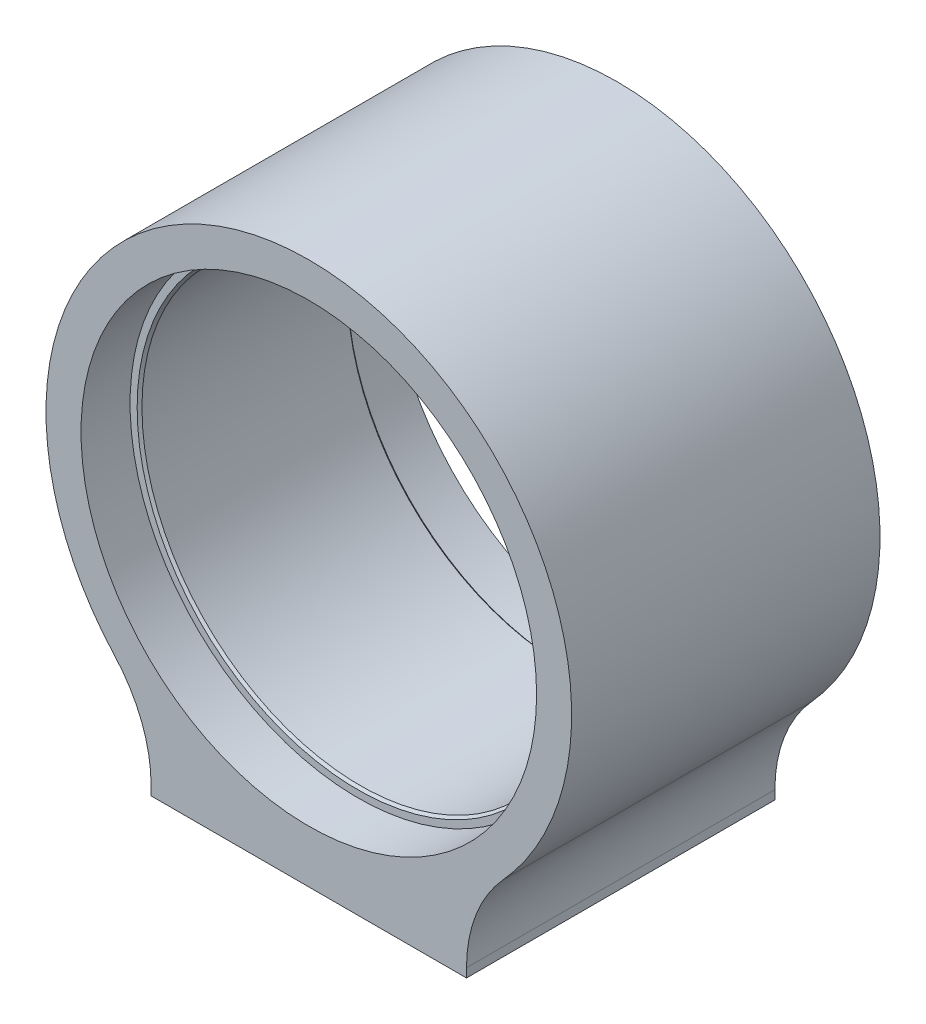
ISO-10303-21;
HEADER;
FILE_DESCRIPTION(('STEP AP214'),'2;1');
FILE_NAME('part.step','',(''),(''),'','','');
FILE_SCHEMA(('AUTOMOTIVE_DESIGN { 1 0 10303 214 1 1 1 1 }'));
ENDSEC;
DATA;
#1=APPLICATION_CONTEXT('core data for automotive mechanical design processes');
#2=APPLICATION_PROTOCOL_DEFINITION('international standard','automotive_design',2000,#1);
#3=PRODUCT_CONTEXT('',#1,'mechanical');
#4=PRODUCT('Part','Part','',(#3));
#5=PRODUCT_RELATED_PRODUCT_CATEGORY('part','',(#4));
#6=PRODUCT_DEFINITION_FORMATION('','',#4);
#7=PRODUCT_DEFINITION_CONTEXT('part definition',#1,'design');
#8=PRODUCT_DEFINITION('design','',#6,#7);
#9=PRODUCT_DEFINITION_SHAPE('','',#8);
#10=(LENGTH_UNIT() NAMED_UNIT(*) SI_UNIT(.MILLI.,.METRE.));
#11=(NAMED_UNIT(*) PLANE_ANGLE_UNIT() SI_UNIT($,.RADIAN.));
#12=(NAMED_UNIT(*) SI_UNIT($,.STERADIAN.) SOLID_ANGLE_UNIT());
#13=UNCERTAINTY_MEASURE_WITH_UNIT(LENGTH_MEASURE(1.E-05),#10,'distance_accuracy_value','');
#14=(GEOMETRIC_REPRESENTATION_CONTEXT(3) GLOBAL_UNCERTAINTY_ASSIGNED_CONTEXT((#13)) GLOBAL_UNIT_ASSIGNED_CONTEXT((#10,
#11,#12)) REPRESENTATION_CONTEXT('',''));
#15=CARTESIAN_POINT('',(0.,0.,0.));
#16=DIRECTION('',(0.,0.,1.));
#17=DIRECTION('',(1.,0.,0.));
#18=AXIS2_PLACEMENT_3D('',#15,#16,#17);
#19=CARTESIAN_POINT('',(0.,0.,-15.));
#20=DIRECTION('',(0.,0.,1.));
#21=DIRECTION('',(1.,0.,0.));
#22=AXIS2_PLACEMENT_3D('',#19,#20,#21);
#23=CYLINDRICAL_SURFACE('',#22,37.5);
#24=CARTESIAN_POINT('',(0.,0.,22.));
#25=DIRECTION('',(0.,0.,1.));
#26=DIRECTION('',(1.,0.,0.));
#27=AXIS2_PLACEMENT_3D('',#24,#25,#26);
#28=CIRCLE('',#27,37.5);
#29=CARTESIAN_POINT('',(27.7173913043478,-25.2585870404831,22.));
#30=VERTEX_POINT('',#29);
#31=CARTESIAN_POINT('',(-27.7173913043478,-25.2585870404831,22.));
#32=VERTEX_POINT('',#31);
#33=EDGE_CURVE('E182',#30,#32,#28,.T.);
#34=ORIENTED_EDGE('',*,*,#33,.F.);
#35=DIRECTION('',(0.,0.,1.));
#36=VECTOR('',#35,1.);
#37=CARTESIAN_POINT('',(27.7173913043478,-25.2585870404831,-15.));
#38=LINE('',#37,#36);
#39=CARTESIAN_POINT('',(27.7173913043478,-25.2585870404831,-22.));
#40=VERTEX_POINT('',#39);
#41=EDGE_CURVE('E234',#30,#40,#38,.F.);
#42=ORIENTED_EDGE('',*,*,#41,.T.);
#43=CARTESIAN_POINT('',(0.,0.,-22.));
#44=DIRECTION('',(0.,0.,-1.));
#45=DIRECTION('',(-1.,0.,0.));
#46=AXIS2_PLACEMENT_3D('',#43,#44,#45);
#47=CIRCLE('',#46,37.5);
#48=CARTESIAN_POINT('',(-27.7173913043478,-25.2585870404831,-22.));
#49=VERTEX_POINT('',#48);
#50=EDGE_CURVE('E206',#49,#40,#47,.T.);
#51=ORIENTED_EDGE('',*,*,#50,.F.);
#52=DIRECTION('',(0.,0.,1.));
#53=VECTOR('',#52,1.);
#54=CARTESIAN_POINT('',(-27.7173913043478,-25.2585870404832,-15.));
#55=LINE('',#54,#53);
#56=EDGE_CURVE('E232',#49,#32,#55,.T.);
#57=ORIENTED_EDGE('',*,*,#56,.T.);
#58=EDGE_LOOP('',(#34,#42,#51,#57));
#59=FACE_BOUND('',#58,.T.);
#60=ADVANCED_FACE('F34',(#59),#23,.T.);
#61=CARTESIAN_POINT('',(0.,0.,-15.));
#62=DIRECTION('',(0.,0.,1.));
#63=DIRECTION('',(1.,0.,0.));
#64=AXIS2_PLACEMENT_3D('',#61,#62,#63);
#65=PLANE('',#64);
#66=CARTESIAN_POINT('',(0.,0.,-15.));
#67=DIRECTION('',(0.,0.,-1.));
#68=DIRECTION('',(-1.,0.,0.));
#69=AXIS2_PLACEMENT_3D('',#66,#67,#68);
#70=CIRCLE('',#69,31.4930364542791);
#71=CARTESIAN_POINT('',(-31.4930364542791,0.,-15.));
#72=VERTEX_POINT('',#71);
#73=EDGE_CURVE('E149',#72,#72,#70,.T.);
#74=ORIENTED_EDGE('',*,*,#73,.F.);
#75=EDGE_LOOP('',(#74));
#76=FACE_BOUND('',#75,.T.);
#77=CARTESIAN_POINT('',(0.,0.,-15.));
#78=DIRECTION('',(0.,0.,-1.));
#79=DIRECTION('',(-1.,0.,0.));
#80=AXIS2_PLACEMENT_3D('',#77,#78,#79);
#81=CIRCLE('',#80,32.5);
#82=CARTESIAN_POINT('',(-32.5,0.,-15.));
#83=VERTEX_POINT('',#82);
#84=EDGE_CURVE('E202',#83,#83,#81,.T.);
#85=ORIENTED_EDGE('',*,*,#84,.T.);
#86=EDGE_LOOP('',(#85));
#87=FACE_BOUND('',#86,.T.);
#88=ADVANCED_FACE('F278',(#76,#87),#65,.F.);
#89=CARTESIAN_POINT('',(0.,0.,-15.));
#90=DIRECTION('',(0.,0.,1.));
#91=DIRECTION('',(1.,0.,0.));
#92=AXIS2_PLACEMENT_3D('',#89,#90,#91);
#93=CYLINDRICAL_SURFACE('',#92,31.15);
#94=CARTESIAN_POINT('',(0.,0.,-14.6569635457209));
#95=DIRECTION('',(0.,0.,-1.));
#96=DIRECTION('',(-1.,0.,0.));
#97=AXIS2_PLACEMENT_3D('',#94,#95,#96);
#98=CIRCLE('',#97,31.15);
#99=CARTESIAN_POINT('',(-31.15,0.,-14.6569635457209));
#100=VERTEX_POINT('',#99);
#101=EDGE_CURVE('E38',#100,#100,#98,.T.);
#102=ORIENTED_EDGE('',*,*,#101,.T.);
#103=EDGE_LOOP('',(#102));
#104=FACE_BOUND('',#103,.T.);
#105=CARTESIAN_POINT('',(0.,0.,14.6569635457209));
#106=DIRECTION('',(0.,0.,1.));
#107=DIRECTION('',(1.,0.,0.));
#108=AXIS2_PLACEMENT_3D('',#105,#106,#107);
#109=CIRCLE('',#108,31.15);
#110=CARTESIAN_POINT('',(31.15,0.,14.6569635457209));
#111=VERTEX_POINT('',#110);
#112=EDGE_CURVE('E155',#111,#111,#109,.T.);
#113=ORIENTED_EDGE('',*,*,#112,.T.);
#114=EDGE_LOOP('',(#113));
#115=FACE_BOUND('',#114,.T.);
#116=ADVANCED_FACE('F283',(#104,#115),#93,.F.);
#117=CARTESIAN_POINT('',(0.,0.,15.));
#118=DIRECTION('',(0.,0.,1.));
#119=DIRECTION('',(1.,0.,0.));
#120=AXIS2_PLACEMENT_3D('',#117,#118,#119);
#121=PLANE('',#120);
#122=CARTESIAN_POINT('',(0.,0.,15.));
#123=DIRECTION('',(0.,0.,-1.));
#124=DIRECTION('',(-1.,0.,0.));
#125=AXIS2_PLACEMENT_3D('',#122,#123,#124);
#126=CIRCLE('',#125,31.4930364542791);
#127=CARTESIAN_POINT('',(-31.4930364542791,0.,15.));
#128=VERTEX_POINT('',#127);
#129=EDGE_CURVE('E152',#128,#128,#126,.T.);
#130=ORIENTED_EDGE('',*,*,#129,.T.);
#131=EDGE_LOOP('',(#130));
#132=FACE_BOUND('',#131,.T.);
#133=CARTESIAN_POINT('',(0.,0.,15.));
#134=DIRECTION('',(0.,0.,1.));
#135=DIRECTION('',(1.,0.,0.));
#136=AXIS2_PLACEMENT_3D('',#133,#134,#135);
#137=CIRCLE('',#136,32.5);
#138=CARTESIAN_POINT('',(32.5,0.,15.));
#139=VERTEX_POINT('',#138);
#140=EDGE_CURVE('E229',#139,#139,#137,.F.);
#141=ORIENTED_EDGE('',*,*,#140,.F.);
#142=EDGE_LOOP('',(#141));
#143=FACE_BOUND('',#142,.T.);
#144=ADVANCED_FACE('F288',(#132,#143),#121,.T.);
#145=CARTESIAN_POINT('',(0.,0.,-22.));
#146=DIRECTION('',(0.,0.,1.));
#147=DIRECTION('',(1.,0.,0.));
#148=AXIS2_PLACEMENT_3D('',#145,#146,#147);
#149=CYLINDRICAL_SURFACE('',#148,32.5);
#150=CARTESIAN_POINT('',(0.,0.,-22.));
#151=DIRECTION('',(0.,0.,-1.));
#152=DIRECTION('',(-1.,0.,0.));
#153=AXIS2_PLACEMENT_3D('',#150,#151,#152);
#154=CIRCLE('',#153,32.5);
#155=CARTESIAN_POINT('',(-32.5,0.,-22.));
#156=VERTEX_POINT('',#155);
#157=EDGE_CURVE('E203',#156,#156,#154,.T.);
#158=ORIENTED_EDGE('',*,*,#157,.T.);
#159=EDGE_LOOP('',(#158));
#160=FACE_BOUND('',#159,.T.);
#161=ORIENTED_EDGE('',*,*,#84,.F.);
#162=EDGE_LOOP('',(#161));
#163=FACE_BOUND('',#162,.T.);
#164=ADVANCED_FACE('F293',(#160,#163),#149,.F.);
#165=CARTESIAN_POINT('',(0.,0.,-22.));
#166=DIRECTION('',(0.,0.,-1.));
#167=DIRECTION('',(-1.,0.,0.));
#168=AXIS2_PLACEMENT_3D('',#165,#166,#167);
#169=PLANE('',#168);
#170=ORIENTED_EDGE('',*,*,#157,.F.);
#171=EDGE_LOOP('',(#170));
#172=FACE_BOUND('',#171,.T.);
#173=DIRECTION('',(0.,-1.,0.));
#174=VECTOR('',#173,1.);
#175=CARTESIAN_POINT('',(-22.5,-40.,-22.));
#176=LINE('',#175,#174);
#177=CARTESIAN_POINT('',(-22.5,-38.7298334620742,-22.));
#178=VERTEX_POINT('',#177);
#179=CARTESIAN_POINT('',(-22.5,-40.,-22.));
#180=VERTEX_POINT('',#179);
#181=EDGE_CURVE('E158',#178,#180,#176,.T.);
#182=ORIENTED_EDGE('',*,*,#181,.F.);
#183=CARTESIAN_POINT('',(-42.5,-38.7298334620742,-22.));
#184=DIRECTION('',(0.,0.,-1.));
#185=DIRECTION('',(-1.,0.,0.));
#186=AXIS2_PLACEMENT_3D('',#183,#184,#185);
#187=CIRCLE('',#186,20.);
#188=EDGE_CURVE('E44',#178,#49,#187,.F.);
#189=ORIENTED_EDGE('',*,*,#188,.T.);
#190=ORIENTED_EDGE('',*,*,#50,.T.);
#191=CARTESIAN_POINT('',(42.5,-38.7298334620742,-22.));
#192=DIRECTION('',(0.,0.,-1.));
#193=DIRECTION('',(-1.,0.,0.));
#194=AXIS2_PLACEMENT_3D('',#191,#192,#193);
#195=CIRCLE('',#194,20.);
#196=CARTESIAN_POINT('',(22.5,-38.7298334620742,-22.));
#197=VERTEX_POINT('',#196);
#198=EDGE_CURVE('E241',#40,#197,#195,.F.);
#199=ORIENTED_EDGE('',*,*,#198,.T.);
#200=DIRECTION('',(0.,1.,0.));
#201=VECTOR('',#200,1.);
#202=CARTESIAN_POINT('',(22.5,-30.,-22.));
#203=LINE('',#202,#201);
#204=CARTESIAN_POINT('',(22.5,-40.,-22.));
#205=VERTEX_POINT('',#204);
#206=EDGE_CURVE('E159',#205,#197,#203,.T.);
#207=ORIENTED_EDGE('',*,*,#206,.F.);
#208=DIRECTION('',(1.,0.,0.));
#209=VECTOR('',#208,1.);
#210=CARTESIAN_POINT('',(22.5,-40.,-22.));
#211=LINE('',#210,#209);
#212=EDGE_CURVE('E163',#180,#205,#211,.T.);
#213=ORIENTED_EDGE('',*,*,#212,.F.);
#214=EDGE_LOOP('',(#182,#189,#190,#199,#207,#213));
#215=FACE_BOUND('',#214,.T.);
#216=ADVANCED_FACE('F248',(#172,#215),#169,.T.);
#217=CARTESIAN_POINT('',(0.,0.,22.));
#218=DIRECTION('',(0.,0.,-1.));
#219=DIRECTION('',(-1.,0.,0.));
#220=AXIS2_PLACEMENT_3D('',#217,#218,#219);
#221=CYLINDRICAL_SURFACE('',#220,32.5);
#222=CARTESIAN_POINT('',(0.,0.,22.));
#223=DIRECTION('',(0.,0.,1.));
#224=DIRECTION('',(1.,0.,0.));
#225=AXIS2_PLACEMENT_3D('',#222,#223,#224);
#226=CIRCLE('',#225,32.5);
#227=CARTESIAN_POINT('',(32.5,0.,22.));
#228=VERTEX_POINT('',#227);
#229=EDGE_CURVE('E169',#228,#228,#226,.T.);
#230=ORIENTED_EDGE('',*,*,#229,.T.);
#231=EDGE_LOOP('',(#230));
#232=FACE_BOUND('',#231,.T.);
#233=ORIENTED_EDGE('',*,*,#140,.T.);
#234=EDGE_LOOP('',(#233));
#235=FACE_BOUND('',#234,.T.);
#236=ADVANCED_FACE('F319',(#232,#235),#221,.F.);
#237=CARTESIAN_POINT('',(0.,0.,22.));
#238=DIRECTION('',(0.,0.,1.));
#239=DIRECTION('',(1.,0.,0.));
#240=AXIS2_PLACEMENT_3D('',#237,#238,#239);
#241=PLANE('',#240);
#242=ORIENTED_EDGE('',*,*,#229,.F.);
#243=EDGE_LOOP('',(#242));
#244=FACE_BOUND('',#243,.T.);
#245=DIRECTION('',(0.,1.,0.));
#246=VECTOR('',#245,1.);
#247=CARTESIAN_POINT('',(22.5,-30.,22.));
#248=LINE('',#247,#246);
#249=CARTESIAN_POINT('',(22.5,-40.,22.));
#250=VERTEX_POINT('',#249);
#251=CARTESIAN_POINT('',(22.5,-38.7298334620742,22.));
#252=VERTEX_POINT('',#251);
#253=EDGE_CURVE('E170',#250,#252,#248,.T.);
#254=ORIENTED_EDGE('',*,*,#253,.T.);
#255=CARTESIAN_POINT('',(42.5,-38.7298334620742,22.));
#256=DIRECTION('',(0.,0.,1.));
#257=DIRECTION('',(1.,0.,0.));
#258=AXIS2_PLACEMENT_3D('',#255,#256,#257);
#259=CIRCLE('',#258,20.);
#260=EDGE_CURVE('E243',#252,#30,#259,.F.);
#261=ORIENTED_EDGE('',*,*,#260,.T.);
#262=ORIENTED_EDGE('',*,*,#33,.T.);
#263=CARTESIAN_POINT('',(-42.5,-38.7298334620742,22.));
#264=DIRECTION('',(0.,0.,1.));
#265=DIRECTION('',(1.,0.,0.));
#266=AXIS2_PLACEMENT_3D('',#263,#264,#265);
#267=CIRCLE('',#266,20.);
#268=CARTESIAN_POINT('',(-22.5,-38.7298334620742,22.));
#269=VERTEX_POINT('',#268);
#270=EDGE_CURVE('E11',#32,#269,#267,.F.);
#271=ORIENTED_EDGE('',*,*,#270,.T.);
#272=DIRECTION('',(0.,-1.,0.));
#273=VECTOR('',#272,1.);
#274=CARTESIAN_POINT('',(-22.5,-40.,22.));
#275=LINE('',#274,#273);
#276=CARTESIAN_POINT('',(-22.5,-40.,22.));
#277=VERTEX_POINT('',#276);
#278=EDGE_CURVE('E167',#269,#277,#275,.T.);
#279=ORIENTED_EDGE('',*,*,#278,.T.);
#280=DIRECTION('',(1.,0.,0.));
#281=VECTOR('',#280,1.);
#282=CARTESIAN_POINT('',(22.5,-40.,22.));
#283=LINE('',#282,#281);
#284=EDGE_CURVE('E173',#277,#250,#283,.T.);
#285=ORIENTED_EDGE('',*,*,#284,.T.);
#286=EDGE_LOOP('',(#254,#261,#262,#271,#279,#285));
#287=FACE_BOUND('',#286,.T.);
#288=ADVANCED_FACE('F257',(#244,#287),#241,.T.);
#289=CARTESIAN_POINT('',(22.5,-30.,68.0977222864644));
#290=DIRECTION('',(-1.,0.,0.));
#291=DIRECTION('',(0.,-1.,0.));
#292=AXIS2_PLACEMENT_3D('',#289,#290,#291);
#293=PLANE('',#292);
#294=ORIENTED_EDGE('',*,*,#206,.T.);
#295=DIRECTION('',(0.,0.,1.));
#296=VECTOR('',#295,1.);
#297=CARTESIAN_POINT('',(22.5,-38.7298334620742,68.0977222864644));
#298=LINE('',#297,#296);
#299=EDGE_CURVE('E237',#197,#252,#298,.T.);
#300=ORIENTED_EDGE('',*,*,#299,.T.);
#301=ORIENTED_EDGE('',*,*,#253,.F.);
#302=DIRECTION('',(0.,0.,-1.));
#303=VECTOR('',#302,1.);
#304=CARTESIAN_POINT('',(22.5,-40.,68.0977222864644));
#305=LINE('',#304,#303);
#306=EDGE_CURVE('E162',#250,#205,#305,.T.);
#307=ORIENTED_EDGE('',*,*,#306,.T.);
#308=EDGE_LOOP('',(#294,#300,#301,#307));
#309=FACE_BOUND('',#308,.T.);
#310=ADVANCED_FACE('F264',(#309),#293,.F.);
#311=CARTESIAN_POINT('',(-22.5,-40.,68.0977222864644));
#312=DIRECTION('',(1.,0.,0.));
#313=DIRECTION('',(0.,0.,-1.));
#314=AXIS2_PLACEMENT_3D('',#311,#312,#313);
#315=PLANE('',#314);
#316=ORIENTED_EDGE('',*,*,#278,.F.);
#317=DIRECTION('',(0.,0.,1.));
#318=VECTOR('',#317,1.);
#319=CARTESIAN_POINT('',(-22.5,-38.7298334620742,68.0977222864644));
#320=LINE('',#319,#318);
#321=EDGE_CURVE('E239',#269,#178,#320,.F.);
#322=ORIENTED_EDGE('',*,*,#321,.T.);
#323=ORIENTED_EDGE('',*,*,#181,.T.);
#324=DIRECTION('',(0.,0.,-1.));
#325=VECTOR('',#324,1.);
#326=CARTESIAN_POINT('',(-22.5,-40.,68.0977222864644));
#327=LINE('',#326,#325);
#328=EDGE_CURVE('E176',#277,#180,#327,.T.);
#329=ORIENTED_EDGE('',*,*,#328,.F.);
#330=EDGE_LOOP('',(#316,#322,#323,#329));
#331=FACE_BOUND('',#330,.T.);
#332=ADVANCED_FACE('F254',(#331),#315,.F.);
#333=CARTESIAN_POINT('',(22.5,-40.,68.0977222864644));
#334=DIRECTION('',(0.,1.,0.));
#335=DIRECTION('',(0.,0.,1.));
#336=AXIS2_PLACEMENT_3D('',#333,#334,#335);
#337=PLANE('',#336);
#338=CARTESIAN_POINT('',(17.5,-40.,17.5));
#339=DIRECTION('',(0.,-1.,0.));
#340=DIRECTION('',(0.,0.,-1.));
#341=AXIS2_PLACEMENT_3D('',#338,#339,#340);
#342=CIRCLE('',#341,1.25);
#343=CARTESIAN_POINT('',(17.5,-40.,16.25));
#344=VERTEX_POINT('',#343);
#345=EDGE_CURVE('E127',#344,#344,#342,.T.);
#346=ORIENTED_EDGE('',*,*,#345,.F.);
#347=EDGE_LOOP('',(#346));
#348=FACE_BOUND('',#347,.T.);
#349=CARTESIAN_POINT('',(17.5,-40.,-17.5));
#350=DIRECTION('',(0.,-1.,0.));
#351=DIRECTION('',(0.,0.,-1.));
#352=AXIS2_PLACEMENT_3D('',#349,#350,#351);
#353=CIRCLE('',#352,1.25);
#354=CARTESIAN_POINT('',(17.5,-40.,-18.75));
#355=VERTEX_POINT('',#354);
#356=EDGE_CURVE('E126',#355,#355,#353,.T.);
#357=ORIENTED_EDGE('',*,*,#356,.F.);
#358=EDGE_LOOP('',(#357));
#359=FACE_BOUND('',#358,.T.);
#360=CARTESIAN_POINT('',(-17.5,-40.,17.5));
#361=DIRECTION('',(0.,-1.,0.));
#362=DIRECTION('',(0.,0.,-1.));
#363=AXIS2_PLACEMENT_3D('',#360,#361,#362);
#364=CIRCLE('',#363,1.25);
#365=CARTESIAN_POINT('',(-17.5,-40.,16.25));
#366=VERTEX_POINT('',#365);
#367=EDGE_CURVE('E137',#366,#366,#364,.T.);
#368=ORIENTED_EDGE('',*,*,#367,.F.);
#369=EDGE_LOOP('',(#368));
#370=FACE_BOUND('',#369,.T.);
#371=CARTESIAN_POINT('',(-17.5,-40.,-17.5));
#372=DIRECTION('',(0.,-1.,0.));
#373=DIRECTION('',(0.,0.,-1.));
#374=AXIS2_PLACEMENT_3D('',#371,#372,#373);
#375=CIRCLE('',#374,1.25);
#376=CARTESIAN_POINT('',(-17.5,-40.,-18.75));
#377=VERTEX_POINT('',#376);
#378=EDGE_CURVE('E143',#377,#377,#375,.T.);
#379=ORIENTED_EDGE('',*,*,#378,.F.);
#380=EDGE_LOOP('',(#379));
#381=FACE_BOUND('',#380,.T.);
#382=ORIENTED_EDGE('',*,*,#284,.F.);
#383=ORIENTED_EDGE('',*,*,#328,.T.);
#384=ORIENTED_EDGE('',*,*,#212,.T.);
#385=ORIENTED_EDGE('',*,*,#306,.F.);
#386=EDGE_LOOP('',(#382,#383,#384,#385));
#387=FACE_BOUND('',#386,.T.);
#388=ADVANCED_FACE('F261',(#348,#359,#370,#381,#387),#337,.F.);
#389=CARTESIAN_POINT('',(42.5,-38.7298334620742,-15.));
#390=DIRECTION('',(0.,0.,1.));
#391=DIRECTION('',(1.,0.,0.));
#392=AXIS2_PLACEMENT_3D('',#389,#390,#391);
#393=CYLINDRICAL_SURFACE('',#392,20.);
#394=ORIENTED_EDGE('',*,*,#260,.F.);
#395=ORIENTED_EDGE('',*,*,#299,.F.);
#396=ORIENTED_EDGE('',*,*,#198,.F.);
#397=ORIENTED_EDGE('',*,*,#41,.F.);
#398=EDGE_LOOP('',(#394,#395,#396,#397));
#399=FACE_BOUND('',#398,.T.);
#400=ADVANCED_FACE('F267',(#399),#393,.F.);
#401=CARTESIAN_POINT('',(-42.5,-38.7298334620742,-15.));
#402=DIRECTION('',(0.,0.,1.));
#403=DIRECTION('',(1.,0.,0.));
#404=AXIS2_PLACEMENT_3D('',#401,#402,#403);
#405=CYLINDRICAL_SURFACE('',#404,20.);
#406=ORIENTED_EDGE('',*,*,#270,.F.);
#407=ORIENTED_EDGE('',*,*,#56,.F.);
#408=ORIENTED_EDGE('',*,*,#188,.F.);
#409=ORIENTED_EDGE('',*,*,#321,.F.);
#410=EDGE_LOOP('',(#406,#407,#408,#409));
#411=FACE_BOUND('',#410,.T.);
#412=ADVANCED_FACE('F36',(#411),#405,.F.);
#413=CARTESIAN_POINT('',(0.,0.,14.));
#414=DIRECTION('',(0.,0.,1.));
#415=DIRECTION('',(1.,0.,0.));
#416=AXIS2_PLACEMENT_3D('',#413,#414,#415);
#417=CONICAL_SURFACE('',#416,30.4930364542791,0.785398163397443);
#418=ORIENTED_EDGE('',*,*,#129,.F.);
#419=EDGE_LOOP('',(#418));
#420=FACE_BOUND('',#419,.T.);
#421=ORIENTED_EDGE('',*,*,#112,.F.);
#422=EDGE_LOOP('',(#421));
#423=FACE_BOUND('',#422,.T.);
#424=ADVANCED_FACE('F273',(#420,#423),#417,.F.);
#425=CARTESIAN_POINT('',(0.,0.,-14.));
#426=DIRECTION('',(0.,0.,-1.));
#427=DIRECTION('',(1.,0.,0.));
#428=AXIS2_PLACEMENT_3D('',#425,#426,#427);
#429=CONICAL_SURFACE('',#428,30.4930364542791,0.785398163397443);
#430=ORIENTED_EDGE('',*,*,#73,.T.);
#431=EDGE_LOOP('',(#430));
#432=FACE_BOUND('',#431,.T.);
#433=ORIENTED_EDGE('',*,*,#101,.F.);
#434=EDGE_LOOP('',(#433));
#435=FACE_BOUND('',#434,.T.);
#436=ADVANCED_FACE('F301',(#432,#435),#429,.F.);
#437=CARTESIAN_POINT('',(-17.5,-32.,-17.5));
#438=DIRECTION('',(0.,-1.,0.));
#439=DIRECTION('',(0.,0.,-1.));
#440=AXIS2_PLACEMENT_3D('',#437,#438,#439);
#441=CONICAL_SURFACE('',#440,1.25,1.02974425867666);
#442=CARTESIAN_POINT('',(-17.5,-31.2489242262155,-17.5));
#443=VERTEX_POINT('',#442);
#444=VERTEX_LOOP('',#443);
#445=FACE_BOUND('',#444,.T.);
#446=CARTESIAN_POINT('',(-17.5,-32.,-17.5));
#447=DIRECTION('',(0.,-1.,0.));
#448=DIRECTION('',(0.,0.,-1.));
#449=AXIS2_PLACEMENT_3D('',#446,#447,#448);
#450=CIRCLE('',#449,1.25);
#451=CARTESIAN_POINT('',(-17.5,-32.,-18.75));
#452=VERTEX_POINT('',#451);
#453=EDGE_CURVE('E146',#452,#452,#450,.T.);
#454=ORIENTED_EDGE('',*,*,#453,.T.);
#455=EDGE_LOOP('',(#454));
#456=FACE_BOUND('',#455,.T.);
#457=ADVANCED_FACE('F307',(#445,#456),#441,.F.);
#458=CARTESIAN_POINT('',(-17.5,-40.,-17.5));
#459=DIRECTION('',(0.,-1.,0.));
#460=DIRECTION('',(0.,0.,-1.));
#461=AXIS2_PLACEMENT_3D('',#458,#459,#460);
#462=CYLINDRICAL_SURFACE('',#461,1.25);
#463=ORIENTED_EDGE('',*,*,#453,.F.);
#464=EDGE_LOOP('',(#463));
#465=FACE_BOUND('',#464,.T.);
#466=ORIENTED_EDGE('',*,*,#378,.T.);
#467=EDGE_LOOP('',(#466));
#468=FACE_BOUND('',#467,.T.);
#469=ADVANCED_FACE('F578',(#465,#468),#462,.F.);
#470=CARTESIAN_POINT('',(-17.5,-32.,17.5));
#471=DIRECTION('',(0.,-1.,0.));
#472=DIRECTION('',(0.,0.,-1.));
#473=AXIS2_PLACEMENT_3D('',#470,#471,#472);
#474=CONICAL_SURFACE('',#473,1.25,1.02974425867666);
#475=CARTESIAN_POINT('',(-17.5,-31.2489242262155,17.5));
#476=VERTEX_POINT('',#475);
#477=VERTEX_LOOP('',#476);
#478=FACE_BOUND('',#477,.T.);
#479=CARTESIAN_POINT('',(-17.5,-32.,17.5));
#480=DIRECTION('',(0.,-1.,0.));
#481=DIRECTION('',(0.,0.,-1.));
#482=AXIS2_PLACEMENT_3D('',#479,#480,#481);
#483=CIRCLE('',#482,1.25);
#484=CARTESIAN_POINT('',(-17.5,-32.,16.25));
#485=VERTEX_POINT('',#484);
#486=EDGE_CURVE('E140',#485,#485,#483,.T.);
#487=ORIENTED_EDGE('',*,*,#486,.T.);
#488=EDGE_LOOP('',(#487));
#489=FACE_BOUND('',#488,.T.);
#490=ADVANCED_FACE('F587',(#478,#489),#474,.F.);
#491=CARTESIAN_POINT('',(-17.5,-40.,17.5));
#492=DIRECTION('',(0.,-1.,0.));
#493=DIRECTION('',(0.,0.,-1.));
#494=AXIS2_PLACEMENT_3D('',#491,#492,#493);
#495=CYLINDRICAL_SURFACE('',#494,1.25);
#496=ORIENTED_EDGE('',*,*,#486,.F.);
#497=EDGE_LOOP('',(#496));
#498=FACE_BOUND('',#497,.T.);
#499=ORIENTED_EDGE('',*,*,#367,.T.);
#500=EDGE_LOOP('',(#499));
#501=FACE_BOUND('',#500,.T.);
#502=ADVANCED_FACE('F597',(#498,#501),#495,.F.);
#503=CARTESIAN_POINT('',(17.5,-32.,-17.5));
#504=DIRECTION('',(0.,-1.,0.));
#505=DIRECTION('',(0.,0.,-1.));
#506=AXIS2_PLACEMENT_3D('',#503,#504,#505);
#507=CONICAL_SURFACE('',#506,1.25,1.02974425867666);
#508=CARTESIAN_POINT('',(17.5,-31.2489242262155,-17.5));
#509=VERTEX_POINT('',#508);
#510=VERTEX_LOOP('',#509);
#511=FACE_BOUND('',#510,.T.);
#512=CARTESIAN_POINT('',(17.5,-32.,-17.5));
#513=DIRECTION('',(0.,-1.,0.));
#514=DIRECTION('',(0.,0.,-1.));
#515=AXIS2_PLACEMENT_3D('',#512,#513,#514);
#516=CIRCLE('',#515,1.25);
#517=CARTESIAN_POINT('',(17.5,-32.,-18.75));
#518=VERTEX_POINT('',#517);
#519=EDGE_CURVE('E130',#518,#518,#516,.T.);
#520=ORIENTED_EDGE('',*,*,#519,.T.);
#521=EDGE_LOOP('',(#520));
#522=FACE_BOUND('',#521,.T.);
#523=ADVANCED_FACE('F607',(#511,#522),#507,.F.);
#524=CARTESIAN_POINT('',(17.5,-40.,-17.5));
#525=DIRECTION('',(0.,-1.,0.));
#526=DIRECTION('',(0.,0.,-1.));
#527=AXIS2_PLACEMENT_3D('',#524,#525,#526);
#528=CYLINDRICAL_SURFACE('',#527,1.25);
#529=ORIENTED_EDGE('',*,*,#519,.F.);
#530=EDGE_LOOP('',(#529));
#531=FACE_BOUND('',#530,.T.);
#532=ORIENTED_EDGE('',*,*,#356,.T.);
#533=EDGE_LOOP('',(#532));
#534=FACE_BOUND('',#533,.T.);
#535=ADVANCED_FACE('F120',(#531,#534),#528,.F.);
#536=CARTESIAN_POINT('',(17.5,-32.,17.5));
#537=DIRECTION('',(0.,-1.,0.));
#538=DIRECTION('',(0.,0.,-1.));
#539=AXIS2_PLACEMENT_3D('',#536,#537,#538);
#540=CONICAL_SURFACE('',#539,1.25,1.02974425867666);
#541=CARTESIAN_POINT('',(17.5,-31.2489242262155,17.5));
#542=VERTEX_POINT('',#541);
#543=VERTEX_LOOP('',#542);
#544=FACE_BOUND('',#543,.T.);
#545=CARTESIAN_POINT('',(17.5,-32.,17.5));
#546=DIRECTION('',(0.,-1.,0.));
#547=DIRECTION('',(0.,0.,-1.));
#548=AXIS2_PLACEMENT_3D('',#545,#546,#547);
#549=CIRCLE('',#548,1.25);
#550=CARTESIAN_POINT('',(17.5,-32.,16.25));
#551=VERTEX_POINT('',#550);
#552=EDGE_CURVE('E124',#551,#551,#549,.T.);
#553=ORIENTED_EDGE('',*,*,#552,.T.);
#554=EDGE_LOOP('',(#553));
#555=FACE_BOUND('',#554,.T.);
#556=ADVANCED_FACE('F116',(#544,#555),#540,.F.);
#557=CARTESIAN_POINT('',(17.5,-40.,17.5));
#558=DIRECTION('',(0.,-1.,0.));
#559=DIRECTION('',(0.,0.,-1.));
#560=AXIS2_PLACEMENT_3D('',#557,#558,#559);
#561=CYLINDRICAL_SURFACE('',#560,1.25);
#562=ORIENTED_EDGE('',*,*,#552,.F.);
#563=EDGE_LOOP('',(#562));
#564=FACE_BOUND('',#563,.T.);
#565=ORIENTED_EDGE('',*,*,#345,.T.);
#566=EDGE_LOOP('',(#565));
#567=FACE_BOUND('',#566,.T.);
#568=ADVANCED_FACE('F119',(#564,#567),#561,.F.);
#569=CLOSED_SHELL('',(#60,#88,#116,#144,#164,#216,#236,#288,#310,#332,#388,#400,#412,#424,#436,
#457,#469,#490,#502,#523,#535,#556,#568));
#570=CARTESIAN_POINT('',(31.2771424113194,-15.7079713070162,6.99999999999999));
#571=DIRECTION('',(0.,0.,1.));
#572=DIRECTION('',(1.,0.,0.));
#573=AXIS2_PLACEMENT_3D('',#570,#571,#572);
#574=CONICAL_SURFACE('',#573,1.24999999999999,0.785398163397446);
#575=CARTESIAN_POINT('',(31.2771424113194,-15.7079713070162,5.74999999999999));
#576=VERTEX_POINT('',#575);
#577=VERTEX_LOOP('',#576);
#578=FACE_BOUND('',#577,.T.);
#579=CARTESIAN_POINT('',(31.2771424113194,-15.7079713070162,6.99999999999999));
#580=DIRECTION('',(0.,0.,1.));
#581=DIRECTION('',(1.,0.,0.));
#582=AXIS2_PLACEMENT_3D('',#579,#580,#581);
#583=CIRCLE('',#582,1.24999999999999);
#584=CARTESIAN_POINT('',(32.5271424113194,-15.7079713070162,6.99999999999999));
#585=VERTEX_POINT('',#584);
#586=EDGE_CURVE('E226',#585,#585,#583,.T.);
#587=ORIENTED_EDGE('',*,*,#586,.T.);
#588=EDGE_LOOP('',(#587));
#589=FACE_BOUND('',#588,.T.);
#590=ADVANCED_FACE('F393',(#578,#589),#574,.F.);
#591=CARTESIAN_POINT('',(31.2771424113194,-15.7079713070162,15.));
#592=DIRECTION('',(0.,0.,1.));
#593=DIRECTION('',(1.,0.,0.));
#594=AXIS2_PLACEMENT_3D('',#591,#592,#593);
#595=CYLINDRICAL_SURFACE('',#594,1.25);
#596=ORIENTED_EDGE('',*,*,#586,.F.);
#597=EDGE_LOOP('',(#596));
#598=FACE_BOUND('',#597,.T.);
#599=CARTESIAN_POINT('',(31.2771424113194,-15.7079713070162,15.));
#600=DIRECTION('',(0.,0.,1.));
#601=DIRECTION('',(1.,0.,0.));
#602=AXIS2_PLACEMENT_3D('',#599,#600,#601);
#603=CIRCLE('',#602,1.25);
#604=CARTESIAN_POINT('',(32.5271424113194,-15.7079713070162,15.));
#605=VERTEX_POINT('',#604);
#606=EDGE_CURVE('E199',#605,#605,#603,.F.);
#607=ORIENTED_EDGE('',*,*,#606,.F.);
#608=EDGE_LOOP('',(#607));
#609=FACE_BOUND('',#608,.T.);
#610=ADVANCED_FACE('F324',(#598,#609),#595,.F.);
#611=CARTESIAN_POINT('',(0.,0.,15.));
#612=DIRECTION('',(0.,0.,1.));
#613=DIRECTION('',(1.,0.,0.));
#614=AXIS2_PLACEMENT_3D('',#611,#612,#613);
#615=PLANE('',#614);
#616=ORIENTED_EDGE('',*,*,#606,.T.);
#617=EDGE_LOOP('',(#616));
#618=FACE_BOUND('',#617,.T.);
#619=ADVANCED_FACE('F321',(#618),#615,.F.);
#620=CLOSED_SHELL('',(#590,#610,#619));
#621=CARTESIAN_POINT('',(-2.03506901186667,-34.9407855394944,6.99999999999999));
#622=DIRECTION('',(0.,0.,1.));
#623=DIRECTION('',(1.,0.,0.));
#624=AXIS2_PLACEMENT_3D('',#621,#622,#623);
#625=CONICAL_SURFACE('',#624,1.25,0.785398163397447);
#626=CARTESIAN_POINT('',(-2.03506901186667,-34.9407855394944,5.74999999999999));
#627=VERTEX_POINT('',#626);
#628=VERTEX_LOOP('',#627);
#629=FACE_BOUND('',#628,.T.);
#630=CARTESIAN_POINT('',(-2.03506901186667,-34.9407855394944,6.99999999999999));
#631=DIRECTION('',(0.,0.,1.));
#632=DIRECTION('',(1.,0.,0.));
#633=AXIS2_PLACEMENT_3D('',#630,#631,#632);
#634=CIRCLE('',#633,1.25);
#635=CARTESIAN_POINT('',(-0.785069011866668,-34.9407855394944,6.99999999999999));
#636=VERTEX_POINT('',#635);
#637=EDGE_CURVE('E223',#636,#636,#634,.T.);
#638=ORIENTED_EDGE('',*,*,#637,.T.);
#639=EDGE_LOOP('',(#638));
#640=FACE_BOUND('',#639,.T.);
#641=ADVANCED_FACE('F384',(#629,#640),#625,.F.);
#642=CARTESIAN_POINT('',(-2.03506901186667,-34.9407855394944,15.));
#643=DIRECTION('',(0.,0.,1.));
#644=DIRECTION('',(1.,0.,0.));
#645=AXIS2_PLACEMENT_3D('',#642,#643,#644);
#646=CYLINDRICAL_SURFACE('',#645,1.25);
#647=ORIENTED_EDGE('',*,*,#637,.F.);
#648=EDGE_LOOP('',(#647));
#649=FACE_BOUND('',#648,.T.);
#650=CARTESIAN_POINT('',(-2.03506901186667,-34.9407855394944,15.));
#651=DIRECTION('',(0.,0.,1.));
#652=DIRECTION('',(1.,0.,0.));
#653=AXIS2_PLACEMENT_3D('',#650,#651,#652);
#654=CIRCLE('',#653,1.25);
#655=CARTESIAN_POINT('',(-0.785069011866668,-34.9407855394944,15.));
#656=VERTEX_POINT('',#655);
#657=EDGE_CURVE('E196',#656,#656,#654,.F.);
#658=ORIENTED_EDGE('',*,*,#657,.F.);
#659=EDGE_LOOP('',(#658));
#660=FACE_BOUND('',#659,.T.);
#661=ADVANCED_FACE('F381',(#649,#660),#646,.F.);
#662=ORIENTED_EDGE('',*,*,#657,.T.);
#663=EDGE_LOOP('',(#662));
#664=FACE_BOUND('',#663,.T.);
#665=ADVANCED_FACE('F326',(#664),#615,.F.);
#666=CLOSED_SHELL('',(#641,#661,#665));
#667=CARTESIAN_POINT('',(-32.8892417275068,-11.9707050163984,6.99999999999999));
#668=DIRECTION('',(0.,0.,1.));
#669=DIRECTION('',(1.,0.,0.));
#670=AXIS2_PLACEMENT_3D('',#667,#668,#669);
#671=CONICAL_SURFACE('',#670,1.25,0.785398163397448);
#672=CARTESIAN_POINT('',(-32.8892417275068,-11.9707050163984,5.74999999999999));
#673=VERTEX_POINT('',#672);
#674=VERTEX_LOOP('',#673);
#675=FACE_BOUND('',#674,.T.);
#676=CARTESIAN_POINT('',(-32.8892417275068,-11.9707050163984,6.99999999999999));
#677=DIRECTION('',(0.,0.,1.));
#678=DIRECTION('',(1.,0.,0.));
#679=AXIS2_PLACEMENT_3D('',#676,#677,#678);
#680=CIRCLE('',#679,1.25);
#681=CARTESIAN_POINT('',(-31.6392417275068,-11.9707050163984,6.99999999999999));
#682=VERTEX_POINT('',#681);
#683=EDGE_CURVE('E220',#682,#682,#680,.T.);
#684=ORIENTED_EDGE('',*,*,#683,.T.);
#685=EDGE_LOOP('',(#684));
#686=FACE_BOUND('',#685,.T.);
#687=ADVANCED_FACE('F374',(#675,#686),#671,.F.);
#688=CARTESIAN_POINT('',(-32.8892417275068,-11.9707050163984,15.));
#689=DIRECTION('',(0.,0.,1.));
#690=DIRECTION('',(1.,0.,0.));
#691=AXIS2_PLACEMENT_3D('',#688,#689,#690);
#692=CYLINDRICAL_SURFACE('',#691,1.25);
#693=ORIENTED_EDGE('',*,*,#683,.F.);
#694=EDGE_LOOP('',(#693));
#695=FACE_BOUND('',#694,.T.);
#696=CARTESIAN_POINT('',(-32.8892417275068,-11.9707050163984,15.));
#697=DIRECTION('',(0.,0.,1.));
#698=DIRECTION('',(1.,0.,0.));
#699=AXIS2_PLACEMENT_3D('',#696,#697,#698);
#700=CIRCLE('',#699,1.25);
#701=CARTESIAN_POINT('',(-31.6392417275068,-11.9707050163984,15.));
#702=VERTEX_POINT('',#701);
#703=EDGE_CURVE('E193',#702,#702,#700,.F.);
#704=ORIENTED_EDGE('',*,*,#703,.F.);
#705=EDGE_LOOP('',(#704));
#706=FACE_BOUND('',#705,.T.);
#707=ADVANCED_FACE('F370',(#695,#706),#692,.F.);
#708=ORIENTED_EDGE('',*,*,#703,.T.);
#709=EDGE_LOOP('',(#708));
#710=FACE_BOUND('',#709,.T.);
#711=ADVANCED_FACE('F373',(#710),#615,.F.);
#712=CLOSED_SHELL('',(#687,#707,#711));
#713=CARTESIAN_POINT('',(-24.0184573254057,25.4580774550567,6.99999999999999));
#714=DIRECTION('',(0.,0.,1.));
#715=DIRECTION('',(1.,0.,0.));
#716=AXIS2_PLACEMENT_3D('',#713,#714,#715);
#717=CONICAL_SURFACE('',#716,1.25,0.785398163397447);
#718=CARTESIAN_POINT('',(-24.0184573254057,25.4580774550567,5.74999999999999));
#719=VERTEX_POINT('',#718);
#720=VERTEX_LOOP('',#719);
#721=FACE_BOUND('',#720,.T.);
#722=CARTESIAN_POINT('',(-24.0184573254057,25.4580774550567,6.99999999999999));
#723=DIRECTION('',(0.,0.,1.));
#724=DIRECTION('',(1.,0.,0.));
#725=AXIS2_PLACEMENT_3D('',#722,#723,#724);
#726=CIRCLE('',#725,1.25);
#727=CARTESIAN_POINT('',(-22.7684573254057,25.4580774550567,6.99999999999999));
#728=VERTEX_POINT('',#727);
#729=EDGE_CURVE('E217',#728,#728,#726,.T.);
#730=ORIENTED_EDGE('',*,*,#729,.T.);
#731=EDGE_LOOP('',(#730));
#732=FACE_BOUND('',#731,.T.);
#733=ADVANCED_FACE('F363',(#721,#732),#717,.F.);
#734=CARTESIAN_POINT('',(-24.0184573254057,25.4580774550567,15.));
#735=DIRECTION('',(0.,0.,1.));
#736=DIRECTION('',(1.,0.,0.));
#737=AXIS2_PLACEMENT_3D('',#734,#735,#736);
#738=CYLINDRICAL_SURFACE('',#737,1.25);
#739=ORIENTED_EDGE('',*,*,#729,.F.);
#740=EDGE_LOOP('',(#739));
#741=FACE_BOUND('',#740,.T.);
#742=CARTESIAN_POINT('',(-24.0184573254057,25.4580774550567,15.));
#743=DIRECTION('',(0.,0.,1.));
#744=DIRECTION('',(1.,0.,0.));
#745=AXIS2_PLACEMENT_3D('',#742,#743,#744);
#746=CIRCLE('',#745,1.25);
#747=CARTESIAN_POINT('',(-22.7684573254057,25.4580774550567,15.));
#748=VERTEX_POINT('',#747);
#749=EDGE_CURVE('E190',#748,#748,#746,.F.);
#750=ORIENTED_EDGE('',*,*,#749,.F.);
#751=EDGE_LOOP('',(#750));
#752=FACE_BOUND('',#751,.T.);
#753=ADVANCED_FACE('F359',(#741,#752),#738,.F.);
#754=ORIENTED_EDGE('',*,*,#749,.T.);
#755=EDGE_LOOP('',(#754));
#756=FACE_BOUND('',#755,.T.);
#757=ADVANCED_FACE('F362',(#756),#615,.F.);
#758=CLOSED_SHELL('',(#733,#753,#757));
#759=CARTESIAN_POINT('',(13.8627918113705,32.1375637408096,6.99999999999999));
#760=DIRECTION('',(0.,0.,1.));
#761=DIRECTION('',(1.,0.,0.));
#762=AXIS2_PLACEMENT_3D('',#759,#760,#761);
#763=CONICAL_SURFACE('',#762,1.25,0.785398163397447);
#764=CARTESIAN_POINT('',(13.8627918113705,32.1375637408096,5.74999999999999));
#765=VERTEX_POINT('',#764);
#766=VERTEX_LOOP('',#765);
#767=FACE_BOUND('',#766,.T.);
#768=CARTESIAN_POINT('',(13.8627918113705,32.1375637408096,6.99999999999999));
#769=DIRECTION('',(0.,0.,1.));
#770=DIRECTION('',(1.,0.,0.));
#771=AXIS2_PLACEMENT_3D('',#768,#769,#770);
#772=CIRCLE('',#771,1.25);
#773=CARTESIAN_POINT('',(15.1127918113705,32.1375637408096,6.99999999999999));
#774=VERTEX_POINT('',#773);
#775=EDGE_CURVE('E214',#774,#774,#772,.T.);
#776=ORIENTED_EDGE('',*,*,#775,.T.);
#777=EDGE_LOOP('',(#776));
#778=FACE_BOUND('',#777,.T.);
#779=ADVANCED_FACE('F352',(#767,#778),#763,.F.);
#780=CARTESIAN_POINT('',(13.8627918113705,32.1375637408096,15.));
#781=DIRECTION('',(0.,0.,1.));
#782=DIRECTION('',(1.,0.,0.));
#783=AXIS2_PLACEMENT_3D('',#780,#781,#782);
#784=CYLINDRICAL_SURFACE('',#783,1.25);
#785=ORIENTED_EDGE('',*,*,#775,.F.);
#786=EDGE_LOOP('',(#785));
#787=FACE_BOUND('',#786,.T.);
#788=CARTESIAN_POINT('',(13.8627918113705,32.1375637408096,15.));
#789=DIRECTION('',(0.,0.,1.));
#790=DIRECTION('',(1.,0.,0.));
#791=AXIS2_PLACEMENT_3D('',#788,#789,#790);
#792=CIRCLE('',#791,1.25);
#793=CARTESIAN_POINT('',(15.1127918113705,32.1375637408096,15.));
#794=VERTEX_POINT('',#793);
#795=EDGE_CURVE('E187',#794,#794,#792,.F.);
#796=ORIENTED_EDGE('',*,*,#795,.F.);
#797=EDGE_LOOP('',(#796));
#798=FACE_BOUND('',#797,.T.);
#799=ADVANCED_FACE('F348',(#787,#798),#784,.F.);
#800=ORIENTED_EDGE('',*,*,#795,.T.);
#801=EDGE_LOOP('',(#800));
#802=FACE_BOUND('',#801,.T.);
#803=ADVANCED_FACE('F351',(#802),#615,.F.);
#804=CLOSED_SHELL('',(#779,#799,#803));
#805=CARTESIAN_POINT('',(35.,0.,6.99999999999999));
#806=DIRECTION('',(0.,0.,1.));
#807=DIRECTION('',(1.,0.,0.));
#808=AXIS2_PLACEMENT_3D('',#805,#806,#807);
#809=CONICAL_SURFACE('',#808,1.25,0.785398163397448);
#810=CARTESIAN_POINT('',(35.,0.,5.74999999999999));
#811=VERTEX_POINT('',#810);
#812=VERTEX_LOOP('',#811);
#813=FACE_BOUND('',#812,.T.);
#814=CARTESIAN_POINT('',(35.,0.,6.99999999999999));
#815=DIRECTION('',(0.,0.,1.));
#816=DIRECTION('',(1.,0.,0.));
#817=AXIS2_PLACEMENT_3D('',#814,#815,#816);
#818=CIRCLE('',#817,1.25);
#819=CARTESIAN_POINT('',(36.25,0.,6.99999999999999));
#820=VERTEX_POINT('',#819);
#821=EDGE_CURVE('E209',#820,#820,#818,.T.);
#822=ORIENTED_EDGE('',*,*,#821,.T.);
#823=EDGE_LOOP('',(#822));
#824=FACE_BOUND('',#823,.T.);
#825=ADVANCED_FACE('F341',(#813,#824),#809,.F.);
#826=CARTESIAN_POINT('',(35.,0.,15.));
#827=DIRECTION('',(0.,0.,1.));
#828=DIRECTION('',(1.,0.,0.));
#829=AXIS2_PLACEMENT_3D('',#826,#827,#828);
#830=CYLINDRICAL_SURFACE('',#829,1.25);
#831=ORIENTED_EDGE('',*,*,#821,.F.);
#832=EDGE_LOOP('',(#831));
#833=FACE_BOUND('',#832,.T.);
#834=CARTESIAN_POINT('',(35.,0.,15.));
#835=DIRECTION('',(0.,0.,1.));
#836=DIRECTION('',(1.,0.,0.));
#837=AXIS2_PLACEMENT_3D('',#834,#835,#836);
#838=CIRCLE('',#837,1.25);
#839=CARTESIAN_POINT('',(36.25,0.,15.));
#840=VERTEX_POINT('',#839);
#841=EDGE_CURVE('E184',#840,#840,#838,.F.);
#842=ORIENTED_EDGE('',*,*,#841,.F.);
#843=EDGE_LOOP('',(#842));
#844=FACE_BOUND('',#843,.T.);
#845=ADVANCED_FACE('F338',(#833,#844),#830,.F.);
#846=ORIENTED_EDGE('',*,*,#841,.T.);
#847=EDGE_LOOP('',(#846));
#848=FACE_BOUND('',#847,.T.);
#849=ADVANCED_FACE('F327',(#848),#615,.F.);
#850=CLOSED_SHELL('',(#825,#845,#849));
#851=ORIENTED_CLOSED_SHELL('',*,#620,.T.);
#852=ORIENTED_CLOSED_SHELL('',*,#666,.T.);
#853=ORIENTED_CLOSED_SHELL('',*,#712,.T.);
#854=ORIENTED_CLOSED_SHELL('',*,#758,.T.);
#855=ORIENTED_CLOSED_SHELL('',*,#804,.T.);
#856=ORIENTED_CLOSED_SHELL('',*,#850,.T.);
#857=BREP_WITH_VOIDS('B2',#569,(#851,#852,#853,#854,#855,#856));
#858=ADVANCED_BREP_SHAPE_REPRESENTATION('',(#18,#857),#14);
#859=SHAPE_DEFINITION_REPRESENTATION(#9,#858);
ENDSEC;
END-ISO-10303-21;
